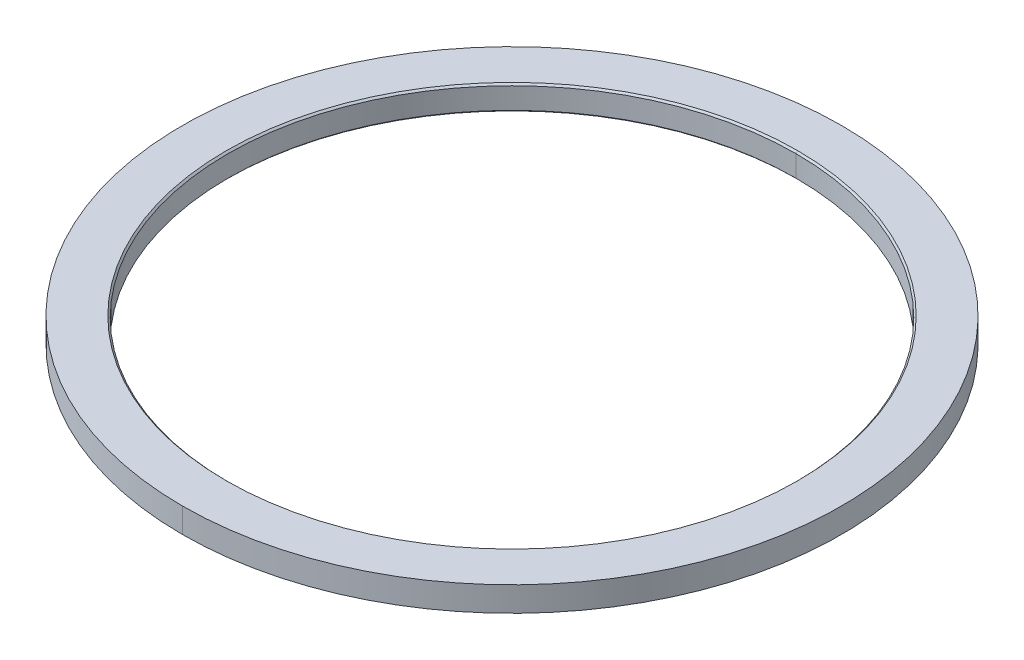
ISO-10303-21;
HEADER;
FILE_DESCRIPTION(('STEP AP214'),'2;1');
FILE_NAME('part.step','',(''),(''),'','','');
FILE_SCHEMA(('AUTOMOTIVE_DESIGN { 1 0 10303 214 1 1 1 1 }'));
ENDSEC;
DATA;
#1=APPLICATION_CONTEXT('core data for automotive mechanical design processes');
#2=APPLICATION_PROTOCOL_DEFINITION('international standard','automotive_design',2000,#1);
#3=PRODUCT_CONTEXT('',#1,'mechanical');
#4=PRODUCT('Part','Part','',(#3));
#5=PRODUCT_RELATED_PRODUCT_CATEGORY('part','',(#4));
#6=PRODUCT_DEFINITION_FORMATION('','',#4);
#7=PRODUCT_DEFINITION_CONTEXT('part definition',#1,'design');
#8=PRODUCT_DEFINITION('design','',#6,#7);
#9=PRODUCT_DEFINITION_SHAPE('','',#8);
#10=(LENGTH_UNIT() NAMED_UNIT(*) SI_UNIT(.MILLI.,.METRE.));
#11=(NAMED_UNIT(*) PLANE_ANGLE_UNIT() SI_UNIT($,.RADIAN.));
#12=(NAMED_UNIT(*) SI_UNIT($,.STERADIAN.) SOLID_ANGLE_UNIT());
#13=UNCERTAINTY_MEASURE_WITH_UNIT(LENGTH_MEASURE(1.E-05),#10,'distance_accuracy_value','');
#14=(GEOMETRIC_REPRESENTATION_CONTEXT(3) GLOBAL_UNCERTAINTY_ASSIGNED_CONTEXT((#13)) GLOBAL_UNIT_ASSIGNED_CONTEXT((#10,
#11,#12)) REPRESENTATION_CONTEXT('',''));
#15=CARTESIAN_POINT('',(0.,0.,0.));
#16=DIRECTION('',(0.,0.,1.));
#17=DIRECTION('',(1.,0.,0.));
#18=AXIS2_PLACEMENT_3D('',#15,#16,#17);
#19=CARTESIAN_POINT('',(0.,0.,0.));
#20=DIRECTION('',(0.,-1.,0.));
#21=DIRECTION('',(1.,0.,0.));
#22=AXIS2_PLACEMENT_3D('',#19,#20,#21);
#23=CONICAL_SURFACE('',#22,50.3,0.785398163397449);
#24=DIRECTION('',(0.,0.707106781186546,-0.70710678118655));
#25=VECTOR('',#24,1.);
#26=CARTESIAN_POINT('',(0.,0.,50.3));
#27=LINE('',#26,#25);
#28=CARTESIAN_POINT('',(0.,0.3,50.));
#29=VERTEX_POINT('',#28);
#30=CARTESIAN_POINT('',(0.,0.,50.3));
#31=VERTEX_POINT('',#30);
#32=EDGE_CURVE('E65',#29,#31,#27,.F.);
#33=ORIENTED_EDGE('',*,*,#32,.T.);
#34=CARTESIAN_POINT('',(0.,0.,0.));
#35=DIRECTION('',(0.,-1.,0.));
#36=DIRECTION('',(1.,0.,0.));
#37=AXIS2_PLACEMENT_3D('',#34,#35,#36);
#38=CIRCLE('',#37,50.3);
#39=CARTESIAN_POINT('',(0.,0.,-50.3));
#40=VERTEX_POINT('',#39);
#41=EDGE_CURVE('E19',#31,#40,#38,.T.);
#42=ORIENTED_EDGE('',*,*,#41,.T.);
#43=DIRECTION('',(0.,0.707106781186546,0.70710678118655));
#44=VECTOR('',#43,1.);
#45=CARTESIAN_POINT('',(0.,0.,-50.3));
#46=LINE('',#45,#44);
#47=CARTESIAN_POINT('',(0.,0.3,-50.));
#48=VERTEX_POINT('',#47);
#49=EDGE_CURVE('E123',#40,#48,#46,.T.);
#50=ORIENTED_EDGE('',*,*,#49,.T.);
#51=CARTESIAN_POINT('',(0.,0.3,0.));
#52=DIRECTION('',(0.,-1.,0.));
#53=DIRECTION('',(0.,0.,-1.));
#54=AXIS2_PLACEMENT_3D('',#51,#52,#53);
#55=CIRCLE('',#54,50.);
#56=EDGE_CURVE('E103',#48,#29,#55,.F.);
#57=ORIENTED_EDGE('',*,*,#56,.T.);
#58=EDGE_LOOP('',(#33,#42,#50,#57));
#59=FACE_BOUND('',#58,.T.);
#60=ADVANCED_FACE('F16',(#59),#23,.F.);
#61=CARTESIAN_POINT('',(0.,0.,0.));
#62=DIRECTION('',(0.,-1.,0.));
#63=DIRECTION('',(1.,0.,0.));
#64=AXIS2_PLACEMENT_3D('',#61,#62,#63);
#65=CONICAL_SURFACE('',#64,50.3,0.785398163397449);
#66=CARTESIAN_POINT('',(0.,0.3,0.));
#67=DIRECTION('',(0.,-1.,0.));
#68=DIRECTION('',(0.,0.,-1.));
#69=AXIS2_PLACEMENT_3D('',#66,#67,#68);
#70=CIRCLE('',#69,50.);
#71=EDGE_CURVE('E99',#29,#48,#70,.F.);
#72=ORIENTED_EDGE('',*,*,#71,.T.);
#73=ORIENTED_EDGE('',*,*,#49,.F.);
#74=CARTESIAN_POINT('',(0.,0.,0.));
#75=DIRECTION('',(0.,-1.,0.));
#76=DIRECTION('',(1.,0.,0.));
#77=AXIS2_PLACEMENT_3D('',#74,#75,#76);
#78=CIRCLE('',#77,50.3);
#79=EDGE_CURVE('E87',#40,#31,#78,.T.);
#80=ORIENTED_EDGE('',*,*,#79,.T.);
#81=ORIENTED_EDGE('',*,*,#32,.F.);
#82=EDGE_LOOP('',(#72,#73,#80,#81));
#83=FACE_BOUND('',#82,.T.);
#84=ADVANCED_FACE('F142',(#83),#65,.F.);
#85=CARTESIAN_POINT('',(0.,0.,0.));
#86=DIRECTION('',(0.,-1.,0.));
#87=DIRECTION('',(0.,0.,-1.));
#88=AXIS2_PLACEMENT_3D('',#85,#86,#87);
#89=CYLINDRICAL_SURFACE('',#88,50.);
#90=CARTESIAN_POINT('',(0.,4.05,0.));
#91=DIRECTION('',(0.,1.,0.));
#92=DIRECTION('',(0.,0.,1.));
#93=AXIS2_PLACEMENT_3D('',#90,#91,#92);
#94=CIRCLE('',#93,50.);
#95=CARTESIAN_POINT('',(0.,4.05,50.));
#96=VERTEX_POINT('',#95);
#97=CARTESIAN_POINT('',(0.,4.05,-50.));
#98=VERTEX_POINT('',#97);
#99=EDGE_CURVE('E76',#96,#98,#94,.T.);
#100=ORIENTED_EDGE('',*,*,#99,.T.);
#101=DIRECTION('',(0.,-1.,0.));
#102=VECTOR('',#101,1.);
#103=CARTESIAN_POINT('',(0.,0.,-50.));
#104=LINE('',#103,#102);
#105=EDGE_CURVE('E106',#98,#48,#104,.T.);
#106=ORIENTED_EDGE('',*,*,#105,.T.);
#107=ORIENTED_EDGE('',*,*,#71,.F.);
#108=DIRECTION('',(0.,-1.,0.));
#109=VECTOR('',#108,1.);
#110=CARTESIAN_POINT('',(0.,0.,50.));
#111=LINE('',#110,#109);
#112=EDGE_CURVE('E97',#29,#96,#111,.F.);
#113=ORIENTED_EDGE('',*,*,#112,.T.);
#114=EDGE_LOOP('',(#100,#106,#107,#113));
#115=FACE_BOUND('',#114,.T.);
#116=ADVANCED_FACE('F98',(#115),#89,.F.);
#117=CARTESIAN_POINT('',(0.,0.,0.));
#118=DIRECTION('',(0.,-1.,0.));
#119=DIRECTION('',(0.,0.,-1.));
#120=AXIS2_PLACEMENT_3D('',#117,#118,#119);
#121=CYLINDRICAL_SURFACE('',#120,50.);
#122=ORIENTED_EDGE('',*,*,#112,.F.);
#123=ORIENTED_EDGE('',*,*,#56,.F.);
#124=ORIENTED_EDGE('',*,*,#105,.F.);
#125=CARTESIAN_POINT('',(0.,4.05,0.));
#126=DIRECTION('',(0.,1.,0.));
#127=DIRECTION('',(0.,0.,1.));
#128=AXIS2_PLACEMENT_3D('',#125,#126,#127);
#129=CIRCLE('',#128,50.);
#130=EDGE_CURVE('E92',#98,#96,#129,.T.);
#131=ORIENTED_EDGE('',*,*,#130,.T.);
#132=EDGE_LOOP('',(#122,#123,#124,#131));
#133=FACE_BOUND('',#132,.T.);
#134=ADVANCED_FACE('F105',(#133),#121,.F.);
#135=CARTESIAN_POINT('',(-51.9,0.,0.));
#136=DIRECTION('',(0.,1.,0.));
#137=DIRECTION('',(0.,0.,1.));
#138=AXIS2_PLACEMENT_3D('',#135,#136,#137);
#139=PLANE('',#138);
#140=CARTESIAN_POINT('',(0.,0.,0.));
#141=DIRECTION('',(0.,1.,0.));
#142=DIRECTION('',(0.,0.,1.));
#143=AXIS2_PLACEMENT_3D('',#140,#141,#142);
#144=CIRCLE('',#143,58.);
#145=CARTESIAN_POINT('',(0.,0.,58.));
#146=VERTEX_POINT('',#145);
#147=CARTESIAN_POINT('',(0.,0.,-58.));
#148=VERTEX_POINT('',#147);
#149=EDGE_CURVE('E109',#146,#148,#144,.T.);
#150=ORIENTED_EDGE('',*,*,#149,.F.);
#151=CARTESIAN_POINT('',(0.,0.,0.));
#152=DIRECTION('',(0.,1.,0.));
#153=DIRECTION('',(0.,0.,1.));
#154=AXIS2_PLACEMENT_3D('',#151,#152,#153);
#155=CIRCLE('',#154,58.);
#156=EDGE_CURVE('E107',#148,#146,#155,.T.);
#157=ORIENTED_EDGE('',*,*,#156,.F.);
#158=EDGE_LOOP('',(#150,#157));
#159=FACE_BOUND('',#158,.T.);
#160=ORIENTED_EDGE('',*,*,#41,.F.);
#161=ORIENTED_EDGE('',*,*,#79,.F.);
#162=EDGE_LOOP('',(#160,#161));
#163=FACE_BOUND('',#162,.T.);
#164=ADVANCED_FACE('F169',(#159,#163),#139,.F.);
#165=CARTESIAN_POINT('',(0.,4.35,0.));
#166=DIRECTION('',(0.,1.,0.));
#167=DIRECTION('',(0.,0.,1.));
#168=AXIS2_PLACEMENT_3D('',#165,#166,#167);
#169=CONICAL_SURFACE('',#168,50.3,0.78539816339745);
#170=ORIENTED_EDGE('',*,*,#99,.F.);
#171=DIRECTION('',(0.,-0.707106781186545,-0.70710678118655));
#172=VECTOR('',#171,1.);
#173=CARTESIAN_POINT('',(0.,4.05,50.));
#174=LINE('',#173,#172);
#175=CARTESIAN_POINT('',(0.,4.35,50.3));
#176=VERTEX_POINT('',#175);
#177=EDGE_CURVE('E80',#96,#176,#174,.F.);
#178=ORIENTED_EDGE('',*,*,#177,.T.);
#179=CARTESIAN_POINT('',(0.,4.35,0.));
#180=DIRECTION('',(0.,1.,0.));
#181=DIRECTION('',(0.,0.,1.));
#182=AXIS2_PLACEMENT_3D('',#179,#180,#181);
#183=CIRCLE('',#182,50.3);
#184=CARTESIAN_POINT('',(0.,4.35,-50.3));
#185=VERTEX_POINT('',#184);
#186=EDGE_CURVE('E138',#176,#185,#183,.T.);
#187=ORIENTED_EDGE('',*,*,#186,.T.);
#188=DIRECTION('',(0.,-0.707106781186545,0.70710678118655));
#189=VECTOR('',#188,1.);
#190=CARTESIAN_POINT('',(0.,4.05,-50.));
#191=LINE('',#190,#189);
#192=EDGE_CURVE('E82',#185,#98,#191,.T.);
#193=ORIENTED_EDGE('',*,*,#192,.T.);
#194=EDGE_LOOP('',(#170,#178,#187,#193));
#195=FACE_BOUND('',#194,.T.);
#196=ADVANCED_FACE('F78',(#195),#169,.F.);
#197=CARTESIAN_POINT('',(0.,4.35,0.));
#198=DIRECTION('',(0.,1.,0.));
#199=DIRECTION('',(0.,0.,1.));
#200=AXIS2_PLACEMENT_3D('',#197,#198,#199);
#201=CONICAL_SURFACE('',#200,50.3,0.78539816339745);
#202=ORIENTED_EDGE('',*,*,#192,.F.);
#203=CARTESIAN_POINT('',(0.,4.35,0.));
#204=DIRECTION('',(0.,1.,0.));
#205=DIRECTION('',(0.,0.,1.));
#206=AXIS2_PLACEMENT_3D('',#203,#204,#205);
#207=CIRCLE('',#206,50.3);
#208=EDGE_CURVE('E94',#185,#176,#207,.T.);
#209=ORIENTED_EDGE('',*,*,#208,.T.);
#210=ORIENTED_EDGE('',*,*,#177,.F.);
#211=ORIENTED_EDGE('',*,*,#130,.F.);
#212=EDGE_LOOP('',(#202,#209,#210,#211));
#213=FACE_BOUND('',#212,.T.);
#214=ADVANCED_FACE('F90',(#213),#201,.F.);
#215=CARTESIAN_POINT('',(0.,-164.048773235279,0.));
#216=DIRECTION('',(0.,1.,0.));
#217=DIRECTION('',(0.,0.,1.));
#218=AXIS2_PLACEMENT_3D('',#215,#216,#217);
#219=CYLINDRICAL_SURFACE('',#218,58.);
#220=DIRECTION('',(0.,1.,0.));
#221=VECTOR('',#220,1.);
#222=CARTESIAN_POINT('',(0.,-164.048773235279,58.));
#223=LINE('',#222,#221);
#224=CARTESIAN_POINT('',(0.,4.34999999999999,58.));
#225=VERTEX_POINT('',#224);
#226=EDGE_CURVE('E140',#225,#146,#223,.F.);
#227=ORIENTED_EDGE('',*,*,#226,.F.);
#228=CARTESIAN_POINT('',(0.,4.34999999999999,0.));
#229=DIRECTION('',(0.,1.,0.));
#230=DIRECTION('',(0.,0.,1.));
#231=AXIS2_PLACEMENT_3D('',#228,#229,#230);
#232=CIRCLE('',#231,58.);
#233=CARTESIAN_POINT('',(0.,4.34999999999999,-58.));
#234=VERTEX_POINT('',#233);
#235=EDGE_CURVE('E25',#225,#234,#232,.F.);
#236=ORIENTED_EDGE('',*,*,#235,.T.);
#237=DIRECTION('',(0.,1.,0.));
#238=VECTOR('',#237,1.);
#239=CARTESIAN_POINT('',(0.,-164.048773235279,-58.));
#240=LINE('',#239,#238);
#241=EDGE_CURVE('E33',#148,#234,#240,.T.);
#242=ORIENTED_EDGE('',*,*,#241,.F.);
#243=ORIENTED_EDGE('',*,*,#156,.T.);
#244=EDGE_LOOP('',(#227,#236,#242,#243));
#245=FACE_BOUND('',#244,.T.);
#246=ADVANCED_FACE('F158',(#245),#219,.T.);
#247=CARTESIAN_POINT('',(0.,-164.048773235279,0.));
#248=DIRECTION('',(0.,1.,0.));
#249=DIRECTION('',(0.,0.,1.));
#250=AXIS2_PLACEMENT_3D('',#247,#248,#249);
#251=CYLINDRICAL_SURFACE('',#250,58.);
#252=CARTESIAN_POINT('',(0.,4.34999999999999,0.));
#253=DIRECTION('',(0.,1.,0.));
#254=DIRECTION('',(0.,0.,1.));
#255=AXIS2_PLACEMENT_3D('',#252,#253,#254);
#256=CIRCLE('',#255,58.);
#257=EDGE_CURVE('E11',#234,#225,#256,.F.);
#258=ORIENTED_EDGE('',*,*,#257,.T.);
#259=ORIENTED_EDGE('',*,*,#226,.T.);
#260=ORIENTED_EDGE('',*,*,#149,.T.);
#261=ORIENTED_EDGE('',*,*,#241,.T.);
#262=EDGE_LOOP('',(#258,#259,#260,#261));
#263=FACE_BOUND('',#262,.T.);
#264=ADVANCED_FACE('F152',(#263),#251,.T.);
#265=CARTESIAN_POINT('',(-51.9,4.35,0.));
#266=DIRECTION('',(0.,-1.,0.));
#267=DIRECTION('',(0.,0.,-1.));
#268=AXIS2_PLACEMENT_3D('',#265,#266,#267);
#269=PLANE('',#268);
#270=ORIENTED_EDGE('',*,*,#235,.F.);
#271=ORIENTED_EDGE('',*,*,#257,.F.);
#272=EDGE_LOOP('',(#270,#271));
#273=FACE_BOUND('',#272,.T.);
#274=ORIENTED_EDGE('',*,*,#186,.F.);
#275=ORIENTED_EDGE('',*,*,#208,.F.);
#276=EDGE_LOOP('',(#274,#275));
#277=FACE_BOUND('',#276,.T.);
#278=ADVANCED_FACE('F150',(#273,#277),#269,.F.);
#279=CLOSED_SHELL('',(#60,#84,#116,#134,#164,#196,#214,#246,#264,#278));
#280=MANIFOLD_SOLID_BREP('B1',#279);
#281=ADVANCED_BREP_SHAPE_REPRESENTATION('',(#18,#280),#14);
#282=SHAPE_DEFINITION_REPRESENTATION(#9,#281);
ENDSEC;
END-ISO-10303-21;
